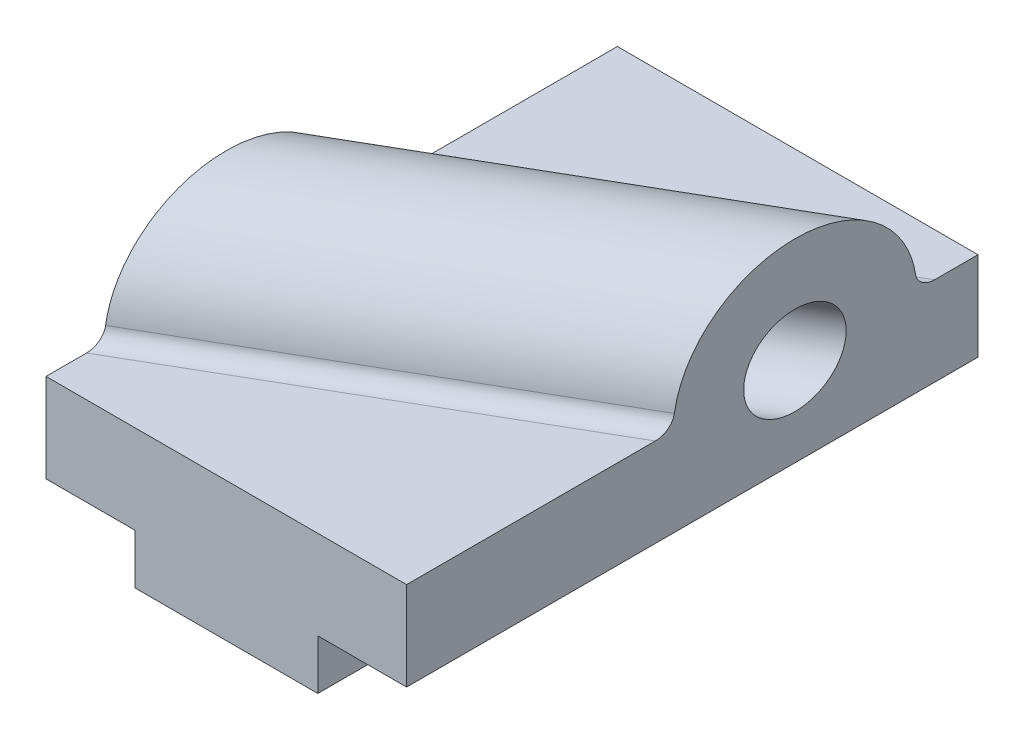
ISO-10303-21;
HEADER;
FILE_DESCRIPTION(('STEP AP214'),'2;1');
FILE_NAME('part.step','',(''),(''),'','','');
FILE_SCHEMA(('AUTOMOTIVE_DESIGN { 1 0 10303 214 1 1 1 1 }'));
ENDSEC;
DATA;
#1=APPLICATION_CONTEXT('core data for automotive mechanical design processes');
#2=APPLICATION_PROTOCOL_DEFINITION('international standard','automotive_design',2000,#1);
#3=PRODUCT_CONTEXT('',#1,'mechanical');
#4=PRODUCT('Part','Part','',(#3));
#5=PRODUCT_RELATED_PRODUCT_CATEGORY('part','',(#4));
#6=PRODUCT_DEFINITION_FORMATION('','',#4);
#7=PRODUCT_DEFINITION_CONTEXT('part definition',#1,'design');
#8=PRODUCT_DEFINITION('design','',#6,#7);
#9=PRODUCT_DEFINITION_SHAPE('','',#8);
#10=(LENGTH_UNIT() NAMED_UNIT(*) SI_UNIT(.MILLI.,.METRE.));
#11=(NAMED_UNIT(*) PLANE_ANGLE_UNIT() SI_UNIT($,.RADIAN.));
#12=(NAMED_UNIT(*) SI_UNIT($,.STERADIAN.) SOLID_ANGLE_UNIT());
#13=UNCERTAINTY_MEASURE_WITH_UNIT(LENGTH_MEASURE(1.E-05),#10,'distance_accuracy_value','');
#14=(GEOMETRIC_REPRESENTATION_CONTEXT(3) GLOBAL_UNCERTAINTY_ASSIGNED_CONTEXT((#13)) GLOBAL_UNIT_ASSIGNED_CONTEXT((#10,
#11,#12)) REPRESENTATION_CONTEXT('',''));
#15=CARTESIAN_POINT('',(0.,0.,0.));
#16=DIRECTION('',(0.,0.,1.));
#17=DIRECTION('',(1.,0.,0.));
#18=AXIS2_PLACEMENT_3D('',#15,#16,#17);
#19=CARTESIAN_POINT('',(-30.5294117647058,11.6176470588235,103.));
#20=DIRECTION('',(0.,-1.,0.));
#21=DIRECTION('',(1.,0.,0.));
#22=AXIS2_PLACEMENT_3D('',#19,#20,#21);
#23=PLANE('',#22);
#24=DIRECTION('',(0.,0.,-1.));
#25=VECTOR('',#24,1.);
#26=CARTESIAN_POINT('',(34.4705882352942,11.6176470588235,103.));
#27=LINE('',#26,#25);
#28=CARTESIAN_POINT('',(34.4705882352942,11.6176470588235,103.));
#29=VERTEX_POINT('',#28);
#30=CARTESIAN_POINT('',(34.4705882352942,11.6176470588235,58.1661147842358));
#31=VERTEX_POINT('',#30);
#32=EDGE_CURVE('E199',#29,#31,#27,.T.);
#33=ORIENTED_EDGE('',*,*,#32,.T.);
#34=DIRECTION('',(0.866025403784438,0.,-0.500000000000001));
#35=VECTOR('',#34,1.);
#36=CARTESIAN_POINT('',(-29.1321644058542,11.6176470588235,94.8871811428041));
#37=LINE('',#36,#35);
#38=CARTESIAN_POINT('',(-30.5294117647058,11.6176470588235,95.6938822815616));
#39=VERTEX_POINT('',#38);
#40=EDGE_CURVE('E178',#31,#39,#37,.F.);
#41=ORIENTED_EDGE('',*,*,#40,.T.);
#42=DIRECTION('',(0.,0.,-1.));
#43=VECTOR('',#42,1.);
#44=CARTESIAN_POINT('',(-30.5294117647058,11.6176470588235,103.));
#45=LINE('',#44,#43);
#46=CARTESIAN_POINT('',(-30.5294117647058,11.6176470588235,103.));
#47=VERTEX_POINT('',#46);
#48=EDGE_CURVE('E190',#47,#39,#45,.T.);
#49=ORIENTED_EDGE('',*,*,#48,.F.);
#50=DIRECTION('',(-1.,0.,0.));
#51=VECTOR('',#50,1.);
#52=CARTESIAN_POINT('',(-30.5294117647058,11.6176470588235,103.));
#53=LINE('',#52,#51);
#54=EDGE_CURVE('E146',#29,#47,#53,.T.);
#55=ORIENTED_EDGE('',*,*,#54,.F.);
#56=EDGE_LOOP('',(#33,#41,#49,#55));
#57=FACE_BOUND('',#56,.T.);
#58=ADVANCED_FACE('F39',(#57),#23,.F.);
#59=CARTESIAN_POINT('',(-30.5294117647058,11.6176470588235,45.3616527130899));
#60=VERTEX_POINT('',#59);
#61=CARTESIAN_POINT('',(-30.5294117647058,11.6176470588235,0.));
#62=VERTEX_POINT('',#61);
#63=EDGE_CURVE('E258',#60,#62,#45,.T.);
#64=ORIENTED_EDGE('',*,*,#63,.F.);
#65=DIRECTION('',(0.866025403784438,0.,-0.500000000000001));
#66=VECTOR('',#65,1.);
#67=CARTESIAN_POINT('',(33.0733408764425,11.6176470588235,8.64058635452167));
#68=LINE('',#67,#66);
#69=CARTESIAN_POINT('',(34.4705882352942,11.6176470588235,7.83388521576416));
#70=VERTEX_POINT('',#69);
#71=EDGE_CURVE('E175',#60,#70,#68,.T.);
#72=ORIENTED_EDGE('',*,*,#71,.T.);
#73=CARTESIAN_POINT('',(34.4705882352942,11.6176470588235,0.));
#74=VERTEX_POINT('',#73);
#75=EDGE_CURVE('E203',#70,#74,#27,.T.);
#76=ORIENTED_EDGE('',*,*,#75,.T.);
#77=DIRECTION('',(-1.,0.,0.));
#78=VECTOR('',#77,1.);
#79=CARTESIAN_POINT('',(-30.5294117647058,11.6176470588235,0.));
#80=LINE('',#79,#78);
#81=EDGE_CURVE('E151',#74,#62,#80,.T.);
#82=ORIENTED_EDGE('',*,*,#81,.T.);
#83=EDGE_LOOP('',(#64,#72,#76,#82));
#84=FACE_BOUND('',#83,.T.);
#85=ADVANCED_FACE('F257',(#84),#23,.F.);
#86=CARTESIAN_POINT('',(-30.5294117647058,11.6176470588235,103.));
#87=DIRECTION('',(1.,0.,0.));
#88=DIRECTION('',(0.,0.,-1.));
#89=AXIS2_PLACEMENT_3D('',#86,#87,#88);
#90=PLANE('',#89);
#91=CARTESIAN_POINT('',(-30.5294117647058,11.6176470588235,70.5277674973258));
#92=DIRECTION('',(1.,0.,0.));
#93=DIRECTION('',(0.,0.,-1.));
#94=AXIS2_PLACEMENT_3D('',#91,#92,#93);
#95=ELLIPSE('',#94,9.23760430703402,8.);
#96=CARTESIAN_POINT('',(-30.5294117647058,11.6176470588235,61.2901631902918));
#97=VERTEX_POINT('',#96);
#98=EDGE_CURVE('E170',#97,#97,#95,.T.);
#99=ORIENTED_EDGE('',*,*,#98,.T.);
#100=EDGE_LOOP('',(#99));
#101=FACE_BOUND('',#100,.T.);
#102=DIRECTION('',(0.,-1.,0.));
#103=VECTOR('',#102,1.);
#104=CARTESIAN_POINT('',(-30.5294117647058,11.6176470588235,0.));
#105=LINE('',#104,#103);
#106=CARTESIAN_POINT('',(-30.5294117647058,-4.38235294117647,0.));
#107=VERTEX_POINT('',#106);
#108=EDGE_CURVE('E155',#62,#107,#105,.T.);
#109=ORIENTED_EDGE('',*,*,#108,.T.);
#110=DIRECTION('',(0.,0.,-1.));
#111=VECTOR('',#110,1.);
#112=CARTESIAN_POINT('',(-30.5294117647058,-4.38235294117647,103.));
#113=LINE('',#112,#111);
#114=CARTESIAN_POINT('',(-30.5294117647058,-4.38235294117647,103.));
#115=VERTEX_POINT('',#114);
#116=EDGE_CURVE('E133',#115,#107,#113,.T.);
#117=ORIENTED_EDGE('',*,*,#116,.F.);
#118=DIRECTION('',(0.,-1.,0.));
#119=VECTOR('',#118,1.);
#120=CARTESIAN_POINT('',(-30.5294117647058,11.6176470588235,103.));
#121=LINE('',#120,#119);
#122=EDGE_CURVE('E141',#47,#115,#121,.T.);
#123=ORIENTED_EDGE('',*,*,#122,.F.);
#124=ORIENTED_EDGE('',*,*,#48,.T.);
#125=CARTESIAN_POINT('',(-30.5294117647058,14.6176470588235,95.6938822815616));
#126=DIRECTION('',(1.,0.,0.));
#127=DIRECTION('',(0.,0.,1.));
#128=AXIS2_PLACEMENT_3D('',#125,#126,#127);
#129=ELLIPSE('',#128,3.46410161513776,3.);
#130=CARTESIAN_POINT('',(-30.5294117647058,14.2085561497326,92.2621393564386));
#131=VERTEX_POINT('',#130);
#132=EDGE_CURVE('E48',#39,#131,#129,.T.);
#133=ORIENTED_EDGE('',*,*,#132,.T.);
#134=CARTESIAN_POINT('',(-30.5294117647058,11.6176470588235,70.5277674973258));
#135=DIRECTION('',(1.,0.,0.));
#136=DIRECTION('',(0.,0.,-1.));
#137=AXIS2_PLACEMENT_3D('',#134,#135,#136);
#138=ELLIPSE('',#137,21.9393102292058,19.);
#139=CARTESIAN_POINT('',(-30.5294117647058,14.2085561497326,48.793395638213));
#140=VERTEX_POINT('',#139);
#141=EDGE_CURVE('E189',#131,#140,#138,.F.);
#142=ORIENTED_EDGE('',*,*,#141,.T.);
#143=CARTESIAN_POINT('',(-30.5294117647058,14.6176470588235,45.3616527130899));
#144=DIRECTION('',(1.,0.,0.));
#145=DIRECTION('',(0.,0.,1.));
#146=AXIS2_PLACEMENT_3D('',#143,#144,#145);
#147=ELLIPSE('',#146,3.46410161513776,3.);
#148=EDGE_CURVE('E181',#140,#60,#147,.T.);
#149=ORIENTED_EDGE('',*,*,#148,.T.);
#150=ORIENTED_EDGE('',*,*,#63,.T.);
#151=EDGE_LOOP('',(#109,#117,#123,#124,#133,#142,#149,#150));
#152=FACE_BOUND('',#151,.T.);
#153=ADVANCED_FACE('F153',(#101,#152),#90,.F.);
#154=CARTESIAN_POINT('',(-30.5294117647058,-4.38235294117647,103.));
#155=DIRECTION('',(0.,1.,0.));
#156=DIRECTION('',(0.,0.,1.));
#157=AXIS2_PLACEMENT_3D('',#154,#155,#156);
#158=PLANE('',#157);
#159=DIRECTION('',(1.,0.,0.));
#160=VECTOR('',#159,1.);
#161=CARTESIAN_POINT('',(-30.5294117647058,-4.38235294117647,0.));
#162=LINE('',#161,#160);
#163=CARTESIAN_POINT('',(-14.5294117647058,-4.38235294117647,0.));
#164=VERTEX_POINT('',#163);
#165=EDGE_CURVE('E243',#107,#164,#162,.T.);
#166=ORIENTED_EDGE('',*,*,#165,.T.);
#167=DIRECTION('',(0.,0.,-1.));
#168=VECTOR('',#167,1.);
#169=CARTESIAN_POINT('',(-14.5294117647058,-4.38235294117647,103.));
#170=LINE('',#169,#168);
#171=CARTESIAN_POINT('',(-14.5294117647058,-4.38235294117647,103.));
#172=VERTEX_POINT('',#171);
#173=EDGE_CURVE('E136',#172,#164,#170,.T.);
#174=ORIENTED_EDGE('',*,*,#173,.F.);
#175=DIRECTION('',(1.,0.,0.));
#176=VECTOR('',#175,1.);
#177=CARTESIAN_POINT('',(-30.5294117647058,-4.38235294117647,103.));
#178=LINE('',#177,#176);
#179=EDGE_CURVE('E129',#115,#172,#178,.T.);
#180=ORIENTED_EDGE('',*,*,#179,.F.);
#181=ORIENTED_EDGE('',*,*,#116,.T.);
#182=EDGE_LOOP('',(#166,#174,#180,#181));
#183=FACE_BOUND('',#182,.T.);
#184=ADVANCED_FACE('F131',(#183),#158,.F.);
#185=CARTESIAN_POINT('',(-14.5294117647058,-4.38235294117647,103.));
#186=DIRECTION('',(1.,0.,0.));
#187=DIRECTION('',(0.,1.,0.));
#188=AXIS2_PLACEMENT_3D('',#185,#186,#187);
#189=PLANE('',#188);
#190=DIRECTION('',(0.,-1.,0.));
#191=VECTOR('',#190,1.);
#192=CARTESIAN_POINT('',(-14.5294117647058,-4.38235294117647,0.));
#193=LINE('',#192,#191);
#194=CARTESIAN_POINT('',(-14.5294117647059,-13.3823529411765,0.));
#195=VERTEX_POINT('',#194);
#196=EDGE_CURVE('E234',#164,#195,#193,.T.);
#197=ORIENTED_EDGE('',*,*,#196,.T.);
#198=DIRECTION('',(0.,0.,-1.));
#199=VECTOR('',#198,1.);
#200=CARTESIAN_POINT('',(-14.5294117647059,-13.3823529411765,103.));
#201=LINE('',#200,#199);
#202=CARTESIAN_POINT('',(-14.5294117647059,-13.3823529411765,103.));
#203=VERTEX_POINT('',#202);
#204=EDGE_CURVE('E163',#203,#195,#201,.T.);
#205=ORIENTED_EDGE('',*,*,#204,.F.);
#206=DIRECTION('',(0.,-1.,0.));
#207=VECTOR('',#206,1.);
#208=CARTESIAN_POINT('',(-14.5294117647058,-4.38235294117647,103.));
#209=LINE('',#208,#207);
#210=EDGE_CURVE('E140',#172,#203,#209,.T.);
#211=ORIENTED_EDGE('',*,*,#210,.F.);
#212=ORIENTED_EDGE('',*,*,#173,.T.);
#213=EDGE_LOOP('',(#197,#205,#211,#212));
#214=FACE_BOUND('',#213,.T.);
#215=ADVANCED_FACE('F322',(#214),#189,.F.);
#216=CARTESIAN_POINT('',(-14.5294117647059,-13.3823529411765,103.));
#217=DIRECTION('',(0.,1.,0.));
#218=DIRECTION('',(0.,0.,1.));
#219=AXIS2_PLACEMENT_3D('',#216,#217,#218);
#220=PLANE('',#219);
#221=DIRECTION('',(1.,0.,0.));
#222=VECTOR('',#221,1.);
#223=CARTESIAN_POINT('',(-14.5294117647059,-13.3823529411765,0.));
#224=LINE('',#223,#222);
#225=CARTESIAN_POINT('',(18.4705882352942,-13.3823529411765,0.));
#226=VERTEX_POINT('',#225);
#227=EDGE_CURVE('E227',#195,#226,#224,.T.);
#228=ORIENTED_EDGE('',*,*,#227,.T.);
#229=DIRECTION('',(0.,0.,-1.));
#230=VECTOR('',#229,1.);
#231=CARTESIAN_POINT('',(18.4705882352942,-13.3823529411765,103.));
#232=LINE('',#231,#230);
#233=CARTESIAN_POINT('',(18.4705882352942,-13.3823529411765,103.));
#234=VERTEX_POINT('',#233);
#235=EDGE_CURVE('E216',#234,#226,#232,.T.);
#236=ORIENTED_EDGE('',*,*,#235,.F.);
#237=DIRECTION('',(1.,0.,0.));
#238=VECTOR('',#237,1.);
#239=CARTESIAN_POINT('',(-14.5294117647059,-13.3823529411765,103.));
#240=LINE('',#239,#238);
#241=EDGE_CURVE('E228',#203,#234,#240,.T.);
#242=ORIENTED_EDGE('',*,*,#241,.F.);
#243=ORIENTED_EDGE('',*,*,#204,.T.);
#244=EDGE_LOOP('',(#228,#236,#242,#243));
#245=FACE_BOUND('',#244,.T.);
#246=ADVANCED_FACE('F225',(#245),#220,.F.);
#247=CARTESIAN_POINT('',(18.4705882352942,-13.3823529411765,103.));
#248=DIRECTION('',(-1.,0.,0.));
#249=DIRECTION('',(0.,0.,1.));
#250=AXIS2_PLACEMENT_3D('',#247,#248,#249);
#251=PLANE('',#250);
#252=DIRECTION('',(0.,1.,0.));
#253=VECTOR('',#252,1.);
#254=CARTESIAN_POINT('',(18.4705882352942,-13.3823529411765,0.));
#255=LINE('',#254,#253);
#256=CARTESIAN_POINT('',(18.4705882352942,-4.38235294117647,0.));
#257=VERTEX_POINT('',#256);
#258=EDGE_CURVE('E236',#226,#257,#255,.T.);
#259=ORIENTED_EDGE('',*,*,#258,.T.);
#260=DIRECTION('',(0.,0.,-1.));
#261=VECTOR('',#260,1.);
#262=CARTESIAN_POINT('',(18.4705882352942,-4.38235294117647,103.));
#263=LINE('',#262,#261);
#264=CARTESIAN_POINT('',(18.4705882352942,-4.38235294117647,103.));
#265=VERTEX_POINT('',#264);
#266=EDGE_CURVE('E208',#265,#257,#263,.T.);
#267=ORIENTED_EDGE('',*,*,#266,.F.);
#268=DIRECTION('',(0.,1.,0.));
#269=VECTOR('',#268,1.);
#270=CARTESIAN_POINT('',(18.4705882352942,-13.3823529411765,103.));
#271=LINE('',#270,#269);
#272=EDGE_CURVE('E276',#234,#265,#271,.T.);
#273=ORIENTED_EDGE('',*,*,#272,.F.);
#274=ORIENTED_EDGE('',*,*,#235,.T.);
#275=EDGE_LOOP('',(#259,#267,#273,#274));
#276=FACE_BOUND('',#275,.T.);
#277=ADVANCED_FACE('F315',(#276),#251,.F.);
#278=CARTESIAN_POINT('',(18.4705882352942,-4.38235294117647,103.));
#279=DIRECTION('',(0.,1.,0.));
#280=DIRECTION('',(0.,0.,1.));
#281=AXIS2_PLACEMENT_3D('',#278,#279,#280);
#282=PLANE('',#281);
#283=DIRECTION('',(1.,0.,0.));
#284=VECTOR('',#283,1.);
#285=CARTESIAN_POINT('',(18.4705882352942,-4.38235294117647,0.));
#286=LINE('',#285,#284);
#287=CARTESIAN_POINT('',(34.4705882352942,-4.38235294117647,0.));
#288=VERTEX_POINT('',#287);
#289=EDGE_CURVE('E241',#257,#288,#286,.T.);
#290=ORIENTED_EDGE('',*,*,#289,.T.);
#291=DIRECTION('',(0.,0.,-1.));
#292=VECTOR('',#291,1.);
#293=CARTESIAN_POINT('',(34.4705882352942,-4.38235294117647,103.));
#294=LINE('',#293,#292);
#295=CARTESIAN_POINT('',(34.4705882352942,-4.38235294117647,103.));
#296=VERTEX_POINT('',#295);
#297=EDGE_CURVE('E202',#296,#288,#294,.T.);
#298=ORIENTED_EDGE('',*,*,#297,.F.);
#299=DIRECTION('',(1.,0.,0.));
#300=VECTOR('',#299,1.);
#301=CARTESIAN_POINT('',(18.4705882352942,-4.38235294117647,103.));
#302=LINE('',#301,#300);
#303=EDGE_CURVE('E273',#265,#296,#302,.T.);
#304=ORIENTED_EDGE('',*,*,#303,.F.);
#305=ORIENTED_EDGE('',*,*,#266,.T.);
#306=EDGE_LOOP('',(#290,#298,#304,#305));
#307=FACE_BOUND('',#306,.T.);
#308=ADVANCED_FACE('F311',(#307),#282,.F.);
#309=CARTESIAN_POINT('',(34.4705882352942,11.6176470588235,103.));
#310=DIRECTION('',(-1.,0.,0.));
#311=DIRECTION('',(0.,0.,1.));
#312=AXIS2_PLACEMENT_3D('',#309,#310,#311);
#313=PLANE('',#312);
#314=CARTESIAN_POINT('',(34.4705882352942,11.6176470588235,33.));
#315=DIRECTION('',(-1.,0.,0.));
#316=DIRECTION('',(0.,0.,-1.));
#317=AXIS2_PLACEMENT_3D('',#314,#315,#316);
#318=ELLIPSE('',#317,9.23760430703402,8.);
#319=CARTESIAN_POINT('',(34.4705882352942,11.6176470588235,23.762395692966));
#320=VERTEX_POINT('',#319);
#321=EDGE_CURVE('E167',#320,#320,#318,.T.);
#322=ORIENTED_EDGE('',*,*,#321,.T.);
#323=EDGE_LOOP('',(#322));
#324=FACE_BOUND('',#323,.T.);
#325=DIRECTION('',(0.,1.,0.));
#326=VECTOR('',#325,1.);
#327=CARTESIAN_POINT('',(34.4705882352942,11.6176470588235,0.));
#328=LINE('',#327,#326);
#329=EDGE_CURVE('E249',#288,#74,#328,.T.);
#330=ORIENTED_EDGE('',*,*,#329,.T.);
#331=ORIENTED_EDGE('',*,*,#75,.F.);
#332=CARTESIAN_POINT('',(34.4705882352942,14.6176470588235,7.83388521576416));
#333=DIRECTION('',(-1.,0.,0.));
#334=DIRECTION('',(0.,0.,1.));
#335=AXIS2_PLACEMENT_3D('',#332,#333,#334);
#336=ELLIPSE('',#335,3.46410161513776,3.);
#337=CARTESIAN_POINT('',(34.4705882352942,14.2085561497326,11.2656281408872));
#338=VERTEX_POINT('',#337);
#339=EDGE_CURVE('E184',#70,#338,#336,.T.);
#340=ORIENTED_EDGE('',*,*,#339,.T.);
#341=CARTESIAN_POINT('',(34.4705882352942,11.6176470588235,33.));
#342=DIRECTION('',(-1.,0.,0.));
#343=DIRECTION('',(0.,0.,1.));
#344=AXIS2_PLACEMENT_3D('',#341,#342,#343);
#345=ELLIPSE('',#344,21.9393102292058,19.);
#346=CARTESIAN_POINT('',(34.4705882352942,14.2085561497326,54.7343718591128));
#347=VERTEX_POINT('',#346);
#348=EDGE_CURVE('E196',#347,#338,#345,.T.);
#349=ORIENTED_EDGE('',*,*,#348,.F.);
#350=CARTESIAN_POINT('',(34.4705882352942,14.6176470588235,58.1661147842358));
#351=DIRECTION('',(-1.,0.,0.));
#352=DIRECTION('',(0.,0.,1.));
#353=AXIS2_PLACEMENT_3D('',#350,#351,#352);
#354=ELLIPSE('',#353,3.46410161513776,3.);
#355=EDGE_CURVE('E11',#347,#31,#354,.T.);
#356=ORIENTED_EDGE('',*,*,#355,.T.);
#357=ORIENTED_EDGE('',*,*,#32,.F.);
#358=DIRECTION('',(0.,1.,0.));
#359=VECTOR('',#358,1.);
#360=CARTESIAN_POINT('',(34.4705882352942,11.6176470588235,103.));
#361=LINE('',#360,#359);
#362=EDGE_CURVE('E270',#296,#29,#361,.T.);
#363=ORIENTED_EDGE('',*,*,#362,.F.);
#364=ORIENTED_EDGE('',*,*,#297,.T.);
#365=EDGE_LOOP('',(#330,#331,#340,#349,#356,#357,#363,#364));
#366=FACE_BOUND('',#365,.T.);
#367=ADVANCED_FACE('F308',(#324,#366),#313,.F.);
#368=CARTESIAN_POINT('',(0.,0.,103.));
#369=DIRECTION('',(0.,0.,1.));
#370=DIRECTION('',(1.,0.,0.));
#371=AXIS2_PLACEMENT_3D('',#368,#369,#370);
#372=PLANE('',#371);
#373=ORIENTED_EDGE('',*,*,#122,.T.);
#374=ORIENTED_EDGE('',*,*,#179,.T.);
#375=ORIENTED_EDGE('',*,*,#210,.T.);
#376=ORIENTED_EDGE('',*,*,#241,.T.);
#377=ORIENTED_EDGE('',*,*,#272,.T.);
#378=ORIENTED_EDGE('',*,*,#303,.T.);
#379=ORIENTED_EDGE('',*,*,#362,.T.);
#380=ORIENTED_EDGE('',*,*,#54,.T.);
#381=EDGE_LOOP('',(#373,#374,#375,#376,#377,#378,#379,#380));
#382=FACE_BOUND('',#381,.T.);
#383=ADVANCED_FACE('F144',(#382),#372,.T.);
#384=CARTESIAN_POINT('',(0.,0.,0.));
#385=DIRECTION('',(0.,0.,1.));
#386=DIRECTION('',(1.,0.,0.));
#387=AXIS2_PLACEMENT_3D('',#384,#385,#386);
#388=PLANE('',#387);
#389=ORIENTED_EDGE('',*,*,#108,.F.);
#390=ORIENTED_EDGE('',*,*,#81,.F.);
#391=ORIENTED_EDGE('',*,*,#329,.F.);
#392=ORIENTED_EDGE('',*,*,#289,.F.);
#393=ORIENTED_EDGE('',*,*,#258,.F.);
#394=ORIENTED_EDGE('',*,*,#227,.F.);
#395=ORIENTED_EDGE('',*,*,#196,.F.);
#396=ORIENTED_EDGE('',*,*,#165,.F.);
#397=EDGE_LOOP('',(#389,#390,#391,#392,#393,#394,#395,#396));
#398=FACE_BOUND('',#397,.T.);
#399=ADVANCED_FACE('F233',(#398),#388,.F.);
#400=CARTESIAN_POINT('',(74.1099049160274,11.6176470588235,10.1142298438858));
#401=DIRECTION('',(-0.866025403784438,0.,0.500000000000001));
#402=DIRECTION('',(0.500000000000001,0.,0.866025403784438));
#403=AXIS2_PLACEMENT_3D('',#400,#401,#402);
#404=CYLINDRICAL_SURFACE('',#403,19.);
#405=ORIENTED_EDGE('',*,*,#348,.T.);
#406=DIRECTION('',(-0.866025403784438,0.,0.500000000000001));
#407=VECTOR('',#406,1.);
#408=CARTESIAN_POINT('',(64.6986458333827,14.2085561497326,-6.18654905044877));
#409=LINE('',#408,#407);
#410=EDGE_CURVE('E161',#338,#140,#409,.T.);
#411=ORIENTED_EDGE('',*,*,#410,.T.);
#412=ORIENTED_EDGE('',*,*,#141,.F.);
#413=DIRECTION('',(-0.866025403784438,0.,0.500000000000001));
#414=VECTOR('',#413,1.);
#415=CARTESIAN_POINT('',(83.521163998672,14.2085561497326,26.4150087382204));
#416=LINE('',#415,#414);
#417=EDGE_CURVE('E157',#131,#347,#416,.F.);
#418=ORIENTED_EDGE('',*,*,#417,.T.);
#419=EDGE_LOOP('',(#405,#411,#412,#418));
#420=FACE_BOUND('',#419,.T.);
#421=ADVANCED_FACE('F193',(#420),#404,.T.);
#422=CARTESIAN_POINT('',(-44.5903008971612,11.6176470588235,78.6458256229944));
#423=DIRECTION('',(0.866025403784438,0.,-0.500000000000001));
#424=DIRECTION('',(-0.500000000000001,0.,-0.866025403784438));
#425=AXIS2_PLACEMENT_3D('',#422,#423,#424);
#426=CYLINDRICAL_SURFACE('',#425,8.);
#427=ORIENTED_EDGE('',*,*,#321,.F.);
#428=EDGE_LOOP('',(#427));
#429=FACE_BOUND('',#428,.T.);
#430=ORIENTED_EDGE('',*,*,#98,.F.);
#431=EDGE_LOOP('',(#430));
#432=FACE_BOUND('',#431,.T.);
#433=ADVANCED_FACE('F288',(#429,#432),#426,.F.);
#434=CARTESIAN_POINT('',(63.2126575571757,14.6176470588235,-8.76035624429107));
#435=DIRECTION('',(-0.866025403784438,0.,0.500000000000001));
#436=DIRECTION('',(0.500000000000001,0.,0.866025403784438));
#437=AXIS2_PLACEMENT_3D('',#434,#435,#436);
#438=CYLINDRICAL_SURFACE('',#437,3.);
#439=ORIENTED_EDGE('',*,*,#339,.F.);
#440=ORIENTED_EDGE('',*,*,#71,.F.);
#441=ORIENTED_EDGE('',*,*,#148,.F.);
#442=ORIENTED_EDGE('',*,*,#410,.F.);
#443=EDGE_LOOP('',(#439,#440,#441,#442));
#444=FACE_BOUND('',#443,.T.);
#445=ADVANCED_FACE('F290',(#444),#438,.F.);
#446=CARTESIAN_POINT('',(85.0071522748791,14.6176470588235,28.9888159320626));
#447=DIRECTION('',(-0.866025403784438,0.,0.500000000000001));
#448=DIRECTION('',(0.500000000000001,0.,0.866025403784438));
#449=AXIS2_PLACEMENT_3D('',#446,#447,#448);
#450=CYLINDRICAL_SURFACE('',#449,3.);
#451=ORIENTED_EDGE('',*,*,#355,.F.);
#452=ORIENTED_EDGE('',*,*,#417,.F.);
#453=ORIENTED_EDGE('',*,*,#132,.F.);
#454=ORIENTED_EDGE('',*,*,#40,.F.);
#455=EDGE_LOOP('',(#451,#452,#453,#454));
#456=FACE_BOUND('',#455,.T.);
#457=ADVANCED_FACE('F41',(#456),#450,.F.);
#458=CLOSED_SHELL('',(#58,#85,#153,#184,#215,#246,#277,#308,#367,#383,#399,#421,#433,#445,#457));
#459=MANIFOLD_SOLID_BREP('B2',#458);
#460=ADVANCED_BREP_SHAPE_REPRESENTATION('',(#18,#459),#14);
#461=SHAPE_DEFINITION_REPRESENTATION(#9,#460);
ENDSEC;
END-ISO-10303-21;
